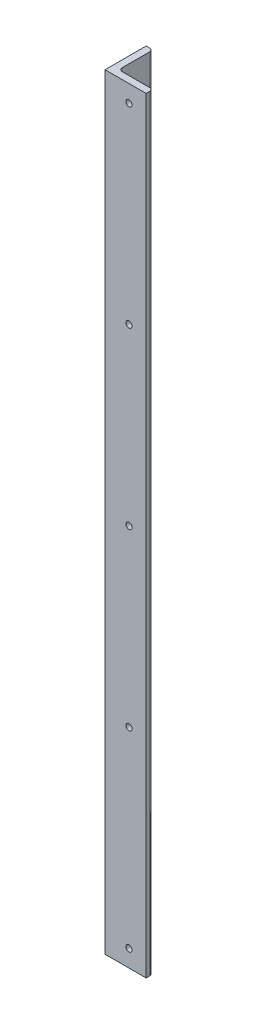
ISO-10303-21;
HEADER;
FILE_DESCRIPTION(('STEP AP214'),'2;1');
FILE_NAME('part.step','',(''),(''),'','','');
FILE_SCHEMA(('AUTOMOTIVE_DESIGN { 1 0 10303 214 1 1 1 1 }'));
ENDSEC;
DATA;
#1=APPLICATION_CONTEXT('core data for automotive mechanical design processes');
#2=APPLICATION_PROTOCOL_DEFINITION('international standard','automotive_design',2000,#1);
#3=PRODUCT_CONTEXT('',#1,'mechanical');
#4=PRODUCT('Part','Part','',(#3));
#5=PRODUCT_RELATED_PRODUCT_CATEGORY('part','',(#4));
#6=PRODUCT_DEFINITION_FORMATION('','',#4);
#7=PRODUCT_DEFINITION_CONTEXT('part definition',#1,'design');
#8=PRODUCT_DEFINITION('design','',#6,#7);
#9=PRODUCT_DEFINITION_SHAPE('','',#8);
#10=(LENGTH_UNIT() NAMED_UNIT(*) SI_UNIT(.MILLI.,.METRE.));
#11=(NAMED_UNIT(*) PLANE_ANGLE_UNIT() SI_UNIT($,.RADIAN.));
#12=(NAMED_UNIT(*) SI_UNIT($,.STERADIAN.) SOLID_ANGLE_UNIT());
#13=UNCERTAINTY_MEASURE_WITH_UNIT(LENGTH_MEASURE(1.E-05),#10,'distance_accuracy_value','');
#14=(GEOMETRIC_REPRESENTATION_CONTEXT(3) GLOBAL_UNCERTAINTY_ASSIGNED_CONTEXT((#13)) GLOBAL_UNIT_ASSIGNED_CONTEXT((#10,
#11,#12)) REPRESENTATION_CONTEXT('',''));
#15=CARTESIAN_POINT('',(0.,0.,0.));
#16=DIRECTION('',(0.,0.,1.));
#17=DIRECTION('',(1.,0.,0.));
#18=AXIS2_PLACEMENT_3D('',#15,#16,#17);
#19=CARTESIAN_POINT('',(0.,355.6,0.));
#20=DIRECTION('',(1.,0.,0.));
#21=DIRECTION('',(0.,0.,-1.));
#22=AXIS2_PLACEMENT_3D('',#19,#20,#21);
#23=PLANE('',#22);
#24=DIRECTION('',(0.,0.,1.));
#25=VECTOR('',#24,1.);
#26=CARTESIAN_POINT('',(0.,0.,0.));
#27=LINE('',#26,#25);
#28=CARTESIAN_POINT('',(0.,0.,-19.05));
#29=VERTEX_POINT('',#28);
#30=CARTESIAN_POINT('',(0.,0.,0.));
#31=VERTEX_POINT('',#30);
#32=EDGE_CURVE('E136',#29,#31,#27,.T.);
#33=ORIENTED_EDGE('',*,*,#32,.T.);
#34=DIRECTION('',(0.,-1.,0.));
#35=VECTOR('',#34,1.);
#36=CARTESIAN_POINT('',(0.,355.6,0.));
#37=LINE('',#36,#35);
#38=CARTESIAN_POINT('',(0.,355.6,0.));
#39=VERTEX_POINT('',#38);
#40=EDGE_CURVE('E11',#39,#31,#37,.T.);
#41=ORIENTED_EDGE('',*,*,#40,.F.);
#42=DIRECTION('',(0.,0.,1.));
#43=VECTOR('',#42,1.);
#44=CARTESIAN_POINT('',(0.,355.6,0.));
#45=LINE('',#44,#43);
#46=CARTESIAN_POINT('',(0.,355.6,-19.05));
#47=VERTEX_POINT('',#46);
#48=EDGE_CURVE('E153',#47,#39,#45,.T.);
#49=ORIENTED_EDGE('',*,*,#48,.F.);
#50=DIRECTION('',(0.,-1.,0.));
#51=VECTOR('',#50,1.);
#52=CARTESIAN_POINT('',(0.,355.6,-19.05));
#53=LINE('',#52,#51);
#54=EDGE_CURVE('E132',#47,#29,#53,.T.);
#55=ORIENTED_EDGE('',*,*,#54,.T.);
#56=EDGE_LOOP('',(#33,#41,#49,#55));
#57=FACE_BOUND('',#56,.T.);
#58=ADVANCED_FACE('F34',(#57),#23,.F.);
#59=CARTESIAN_POINT('',(0.,355.6,0.));
#60=DIRECTION('',(0.,0.,-1.));
#61=DIRECTION('',(-1.,0.,0.));
#62=AXIS2_PLACEMENT_3D('',#59,#60,#61);
#63=PLANE('',#62);
#64=CARTESIAN_POINT('',(11.1125,7.9375,0.));
#65=DIRECTION('',(0.,0.,-1.));
#66=DIRECTION('',(-1.,0.,0.));
#67=AXIS2_PLACEMENT_3D('',#64,#65,#66);
#68=CIRCLE('',#67,1.4224);
#69=CARTESIAN_POINT('',(9.6901,7.9375,0.));
#70=VERTEX_POINT('',#69);
#71=EDGE_CURVE('E140',#70,#70,#68,.T.);
#72=ORIENTED_EDGE('',*,*,#71,.T.);
#73=EDGE_LOOP('',(#72));
#74=FACE_BOUND('',#73,.T.);
#75=CARTESIAN_POINT('',(11.1125,258.7625,0.));
#76=DIRECTION('',(0.,0.,-1.));
#77=DIRECTION('',(-1.,0.,0.));
#78=AXIS2_PLACEMENT_3D('',#75,#76,#77);
#79=CIRCLE('',#78,1.42239999999999);
#80=CARTESIAN_POINT('',(9.69010000000001,258.7625,0.));
#81=VERTEX_POINT('',#80);
#82=EDGE_CURVE('E196',#81,#81,#79,.T.);
#83=ORIENTED_EDGE('',*,*,#82,.T.);
#84=EDGE_LOOP('',(#83));
#85=FACE_BOUND('',#84,.T.);
#86=CARTESIAN_POINT('',(11.1125,177.8,0.));
#87=DIRECTION('',(0.,0.,-1.));
#88=DIRECTION('',(-1.,0.,0.));
#89=AXIS2_PLACEMENT_3D('',#86,#87,#88);
#90=CIRCLE('',#89,1.4224);
#91=CARTESIAN_POINT('',(9.6901,177.8,0.));
#92=VERTEX_POINT('',#91);
#93=EDGE_CURVE('E199',#92,#92,#90,.T.);
#94=ORIENTED_EDGE('',*,*,#93,.T.);
#95=EDGE_LOOP('',(#94));
#96=FACE_BOUND('',#95,.T.);
#97=CARTESIAN_POINT('',(11.1125,96.8375,0.));
#98=DIRECTION('',(0.,0.,-1.));
#99=DIRECTION('',(-1.,0.,0.));
#100=AXIS2_PLACEMENT_3D('',#97,#98,#99);
#101=CIRCLE('',#100,1.4224);
#102=CARTESIAN_POINT('',(9.6901,96.8375,0.));
#103=VERTEX_POINT('',#102);
#104=EDGE_CURVE('E202',#103,#103,#101,.T.);
#105=ORIENTED_EDGE('',*,*,#104,.T.);
#106=EDGE_LOOP('',(#105));
#107=FACE_BOUND('',#106,.T.);
#108=CARTESIAN_POINT('',(11.1125,347.6625,0.));
#109=DIRECTION('',(0.,0.,-1.));
#110=DIRECTION('',(-1.,0.,0.));
#111=AXIS2_PLACEMENT_3D('',#108,#109,#110);
#112=CIRCLE('',#111,1.42239999999999);
#113=CARTESIAN_POINT('',(9.69010000000001,347.6625,0.));
#114=VERTEX_POINT('',#113);
#115=EDGE_CURVE('E205',#114,#114,#112,.T.);
#116=ORIENTED_EDGE('',*,*,#115,.T.);
#117=EDGE_LOOP('',(#116));
#118=FACE_BOUND('',#117,.T.);
#119=DIRECTION('',(1.,0.,0.));
#120=VECTOR('',#119,1.);
#121=CARTESIAN_POINT('',(0.,0.,0.));
#122=LINE('',#121,#120);
#123=CARTESIAN_POINT('',(19.05,0.,0.));
#124=VERTEX_POINT('',#123);
#125=EDGE_CURVE('E139',#31,#124,#122,.T.);
#126=ORIENTED_EDGE('',*,*,#125,.T.);
#127=DIRECTION('',(0.,-1.,0.));
#128=VECTOR('',#127,1.);
#129=CARTESIAN_POINT('',(19.05,355.6,0.));
#130=LINE('',#129,#128);
#131=CARTESIAN_POINT('',(19.05,355.6,0.));
#132=VERTEX_POINT('',#131);
#133=EDGE_CURVE('E42',#132,#124,#130,.T.);
#134=ORIENTED_EDGE('',*,*,#133,.F.);
#135=DIRECTION('',(1.,0.,0.));
#136=VECTOR('',#135,1.);
#137=CARTESIAN_POINT('',(0.,355.6,0.));
#138=LINE('',#137,#136);
#139=EDGE_CURVE('E96',#39,#132,#138,.T.);
#140=ORIENTED_EDGE('',*,*,#139,.F.);
#141=ORIENTED_EDGE('',*,*,#40,.T.);
#142=EDGE_LOOP('',(#126,#134,#140,#141));
#143=FACE_BOUND('',#142,.T.);
#144=ADVANCED_FACE('F246',(#74,#85,#96,#107,#118,#143),#63,.F.);
#145=CARTESIAN_POINT('',(19.05,355.6,-1.58749999999999));
#146=DIRECTION('',(-1.,0.,0.));
#147=DIRECTION('',(0.,0.,1.));
#148=AXIS2_PLACEMENT_3D('',#145,#146,#147);
#149=PLANE('',#148);
#150=DIRECTION('',(0.,0.,-1.));
#151=VECTOR('',#150,1.);
#152=CARTESIAN_POINT('',(19.05,0.,-1.58749999999999));
#153=LINE('',#152,#151);
#154=CARTESIAN_POINT('',(19.05,0.,-1.58749999999999));
#155=VERTEX_POINT('',#154);
#156=EDGE_CURVE('E142',#124,#155,#153,.T.);
#157=ORIENTED_EDGE('',*,*,#156,.T.);
#158=DIRECTION('',(0.,-1.,0.));
#159=VECTOR('',#158,1.);
#160=CARTESIAN_POINT('',(19.05,355.6,-1.58749999999999));
#161=LINE('',#160,#159);
#162=CARTESIAN_POINT('',(19.05,355.6,-1.58749999999999));
#163=VERTEX_POINT('',#162);
#164=EDGE_CURVE('E163',#163,#155,#161,.T.);
#165=ORIENTED_EDGE('',*,*,#164,.F.);
#166=DIRECTION('',(0.,0.,-1.));
#167=VECTOR('',#166,1.);
#168=CARTESIAN_POINT('',(19.05,355.6,-1.58749999999999));
#169=LINE('',#168,#167);
#170=EDGE_CURVE('E171',#132,#163,#169,.T.);
#171=ORIENTED_EDGE('',*,*,#170,.F.);
#172=ORIENTED_EDGE('',*,*,#133,.T.);
#173=EDGE_LOOP('',(#157,#165,#171,#172));
#174=FACE_BOUND('',#173,.T.);
#175=ADVANCED_FACE('F169',(#174),#149,.F.);
#176=CARTESIAN_POINT('',(17.4625,355.6,-1.5875));
#177=DIRECTION('',(0.,-1.,0.));
#178=DIRECTION('',(0.,0.,-1.));
#179=AXIS2_PLACEMENT_3D('',#176,#177,#178);
#180=CYLINDRICAL_SURFACE('',#179,1.5875);
#181=CARTESIAN_POINT('',(17.4625,0.,-1.5875));
#182=DIRECTION('',(0.,1.,0.));
#183=DIRECTION('',(0.,0.,-1.));
#184=AXIS2_PLACEMENT_3D('',#181,#182,#183);
#185=CIRCLE('',#184,1.5875);
#186=CARTESIAN_POINT('',(17.4625,0.,-3.175));
#187=VERTEX_POINT('',#186);
#188=EDGE_CURVE('E144',#155,#187,#185,.T.);
#189=ORIENTED_EDGE('',*,*,#188,.T.);
#190=DIRECTION('',(0.,-1.,0.));
#191=VECTOR('',#190,1.);
#192=CARTESIAN_POINT('',(17.4625,355.6,-3.175));
#193=LINE('',#192,#191);
#194=CARTESIAN_POINT('',(17.4625,355.6,-3.175));
#195=VERTEX_POINT('',#194);
#196=EDGE_CURVE('E160',#195,#187,#193,.T.);
#197=ORIENTED_EDGE('',*,*,#196,.F.);
#198=CARTESIAN_POINT('',(17.4625,355.6,-1.5875));
#199=DIRECTION('',(0.,1.,0.));
#200=DIRECTION('',(0.,0.,-1.));
#201=AXIS2_PLACEMENT_3D('',#198,#199,#200);
#202=CIRCLE('',#201,1.5875);
#203=EDGE_CURVE('E187',#163,#195,#202,.T.);
#204=ORIENTED_EDGE('',*,*,#203,.F.);
#205=ORIENTED_EDGE('',*,*,#164,.T.);
#206=EDGE_LOOP('',(#189,#197,#204,#205));
#207=FACE_BOUND('',#206,.T.);
#208=ADVANCED_FACE('F180',(#207),#180,.T.);
#209=CARTESIAN_POINT('',(4.76250000000001,355.6,-3.175));
#210=DIRECTION('',(0.,0.,1.));
#211=DIRECTION('',(1.,0.,0.));
#212=AXIS2_PLACEMENT_3D('',#209,#210,#211);
#213=PLANE('',#212);
#214=CARTESIAN_POINT('',(11.1125,7.9375,-3.175));
#215=DIRECTION('',(0.,0.,-1.));
#216=DIRECTION('',(-1.,0.,0.));
#217=AXIS2_PLACEMENT_3D('',#214,#215,#216);
#218=CIRCLE('',#217,1.4224);
#219=CARTESIAN_POINT('',(9.6901,7.9375,-3.175));
#220=VERTEX_POINT('',#219);
#221=EDGE_CURVE('E208',#220,#220,#218,.T.);
#222=ORIENTED_EDGE('',*,*,#221,.F.);
#223=EDGE_LOOP('',(#222));
#224=FACE_BOUND('',#223,.T.);
#225=CARTESIAN_POINT('',(11.1125,258.7625,-3.175));
#226=DIRECTION('',(0.,0.,-1.));
#227=DIRECTION('',(-1.,0.,0.));
#228=AXIS2_PLACEMENT_3D('',#225,#226,#227);
#229=CIRCLE('',#228,1.42239999999999);
#230=CARTESIAN_POINT('',(9.69010000000001,258.7625,-3.175));
#231=VERTEX_POINT('',#230);
#232=EDGE_CURVE('E216',#231,#231,#229,.T.);
#233=ORIENTED_EDGE('',*,*,#232,.F.);
#234=EDGE_LOOP('',(#233));
#235=FACE_BOUND('',#234,.T.);
#236=CARTESIAN_POINT('',(11.1125,177.8,-3.175));
#237=DIRECTION('',(0.,0.,-1.));
#238=DIRECTION('',(-1.,0.,0.));
#239=AXIS2_PLACEMENT_3D('',#236,#237,#238);
#240=CIRCLE('',#239,1.4224);
#241=CARTESIAN_POINT('',(9.6901,177.8,-3.175));
#242=VERTEX_POINT('',#241);
#243=EDGE_CURVE('E213',#242,#242,#240,.T.);
#244=ORIENTED_EDGE('',*,*,#243,.F.);
#245=EDGE_LOOP('',(#244));
#246=FACE_BOUND('',#245,.T.);
#247=CARTESIAN_POINT('',(11.1125,96.8375,-3.175));
#248=DIRECTION('',(0.,0.,-1.));
#249=DIRECTION('',(-1.,0.,0.));
#250=AXIS2_PLACEMENT_3D('',#247,#248,#249);
#251=CIRCLE('',#250,1.4224);
#252=CARTESIAN_POINT('',(9.6901,96.8375,-3.175));
#253=VERTEX_POINT('',#252);
#254=EDGE_CURVE('E209',#253,#253,#251,.T.);
#255=ORIENTED_EDGE('',*,*,#254,.F.);
#256=EDGE_LOOP('',(#255));
#257=FACE_BOUND('',#256,.T.);
#258=CARTESIAN_POINT('',(11.1125,347.6625,-3.175));
#259=DIRECTION('',(0.,0.,-1.));
#260=DIRECTION('',(-1.,0.,0.));
#261=AXIS2_PLACEMENT_3D('',#258,#259,#260);
#262=CIRCLE('',#261,1.42239999999999);
#263=CARTESIAN_POINT('',(9.69010000000001,347.6625,-3.175));
#264=VERTEX_POINT('',#263);
#265=EDGE_CURVE('E212',#264,#264,#262,.T.);
#266=ORIENTED_EDGE('',*,*,#265,.F.);
#267=EDGE_LOOP('',(#266));
#268=FACE_BOUND('',#267,.T.);
#269=DIRECTION('',(-1.,0.,0.));
#270=VECTOR('',#269,1.);
#271=CARTESIAN_POINT('',(4.76250000000001,0.,-3.175));
#272=LINE('',#271,#270);
#273=CARTESIAN_POINT('',(4.76250000000001,0.,-3.175));
#274=VERTEX_POINT('',#273);
#275=EDGE_CURVE('E146',#187,#274,#272,.T.);
#276=ORIENTED_EDGE('',*,*,#275,.T.);
#277=DIRECTION('',(0.,-1.,0.));
#278=VECTOR('',#277,1.);
#279=CARTESIAN_POINT('',(4.76250000000001,355.6,-3.175));
#280=LINE('',#279,#278);
#281=CARTESIAN_POINT('',(4.76250000000001,355.6,-3.175));
#282=VERTEX_POINT('',#281);
#283=EDGE_CURVE('E157',#282,#274,#280,.T.);
#284=ORIENTED_EDGE('',*,*,#283,.F.);
#285=DIRECTION('',(-1.,0.,0.));
#286=VECTOR('',#285,1.);
#287=CARTESIAN_POINT('',(4.76250000000001,355.6,-3.175));
#288=LINE('',#287,#286);
#289=EDGE_CURVE('E186',#195,#282,#288,.T.);
#290=ORIENTED_EDGE('',*,*,#289,.F.);
#291=ORIENTED_EDGE('',*,*,#196,.T.);
#292=EDGE_LOOP('',(#276,#284,#290,#291));
#293=FACE_BOUND('',#292,.T.);
#294=ADVANCED_FACE('F184',(#224,#235,#246,#257,#268,#293),#213,.F.);
#295=CARTESIAN_POINT('',(4.7625,355.6,-4.7625));
#296=DIRECTION('',(0.,-1.,0.));
#297=DIRECTION('',(0.,0.,-1.));
#298=AXIS2_PLACEMENT_3D('',#295,#296,#297);
#299=CYLINDRICAL_SURFACE('',#298,1.5875);
#300=CARTESIAN_POINT('',(4.7625,0.,-4.7625));
#301=DIRECTION('',(0.,-1.,0.));
#302=DIRECTION('',(0.,0.,1.));
#303=AXIS2_PLACEMENT_3D('',#300,#301,#302);
#304=CIRCLE('',#303,1.5875);
#305=CARTESIAN_POINT('',(3.175,0.,-4.76250000000001));
#306=VERTEX_POINT('',#305);
#307=EDGE_CURVE('E148',#274,#306,#304,.T.);
#308=ORIENTED_EDGE('',*,*,#307,.T.);
#309=DIRECTION('',(0.,-1.,0.));
#310=VECTOR('',#309,1.);
#311=CARTESIAN_POINT('',(3.175,355.6,-4.76250000000001));
#312=LINE('',#311,#310);
#313=CARTESIAN_POINT('',(3.175,355.6,-4.76250000000001));
#314=VERTEX_POINT('',#313);
#315=EDGE_CURVE('E127',#314,#306,#312,.T.);
#316=ORIENTED_EDGE('',*,*,#315,.F.);
#317=CARTESIAN_POINT('',(4.7625,355.6,-4.7625));
#318=DIRECTION('',(0.,-1.,0.));
#319=DIRECTION('',(0.,0.,1.));
#320=AXIS2_PLACEMENT_3D('',#317,#318,#319);
#321=CIRCLE('',#320,1.5875);
#322=EDGE_CURVE('E118',#282,#314,#321,.T.);
#323=ORIENTED_EDGE('',*,*,#322,.F.);
#324=ORIENTED_EDGE('',*,*,#283,.T.);
#325=EDGE_LOOP('',(#308,#316,#323,#324));
#326=FACE_BOUND('',#325,.T.);
#327=ADVANCED_FACE('F229',(#326),#299,.F.);
#328=CARTESIAN_POINT('',(3.175,355.6,-4.76250000000001));
#329=DIRECTION('',(-1.,0.,0.));
#330=DIRECTION('',(0.,0.,1.));
#331=AXIS2_PLACEMENT_3D('',#328,#329,#330);
#332=PLANE('',#331);
#333=DIRECTION('',(0.,0.,-1.));
#334=VECTOR('',#333,1.);
#335=CARTESIAN_POINT('',(3.175,0.,-4.76250000000001));
#336=LINE('',#335,#334);
#337=CARTESIAN_POINT('',(3.175,0.,-17.4625));
#338=VERTEX_POINT('',#337);
#339=EDGE_CURVE('E126',#306,#338,#336,.T.);
#340=ORIENTED_EDGE('',*,*,#339,.T.);
#341=DIRECTION('',(0.,-1.,0.));
#342=VECTOR('',#341,1.);
#343=CARTESIAN_POINT('',(3.175,355.6,-17.4625));
#344=LINE('',#343,#342);
#345=CARTESIAN_POINT('',(3.175,355.6,-17.4625));
#346=VERTEX_POINT('',#345);
#347=EDGE_CURVE('E123',#346,#338,#344,.T.);
#348=ORIENTED_EDGE('',*,*,#347,.F.);
#349=DIRECTION('',(0.,0.,-1.));
#350=VECTOR('',#349,1.);
#351=CARTESIAN_POINT('',(3.175,355.6,-4.76250000000001));
#352=LINE('',#351,#350);
#353=EDGE_CURVE('E112',#314,#346,#352,.T.);
#354=ORIENTED_EDGE('',*,*,#353,.F.);
#355=ORIENTED_EDGE('',*,*,#315,.T.);
#356=EDGE_LOOP('',(#340,#348,#354,#355));
#357=FACE_BOUND('',#356,.T.);
#358=ADVANCED_FACE('F124',(#357),#332,.F.);
#359=CARTESIAN_POINT('',(1.5875,355.6,-17.4625));
#360=DIRECTION('',(0.,-1.,0.));
#361=DIRECTION('',(0.,0.,-1.));
#362=AXIS2_PLACEMENT_3D('',#359,#360,#361);
#363=CYLINDRICAL_SURFACE('',#362,1.5875);
#364=CARTESIAN_POINT('',(1.5875,0.,-17.4625));
#365=DIRECTION('',(0.,1.,0.));
#366=DIRECTION('',(0.,0.,1.));
#367=AXIS2_PLACEMENT_3D('',#364,#365,#366);
#368=CIRCLE('',#367,1.5875);
#369=CARTESIAN_POINT('',(1.58749999999999,0.,-19.05));
#370=VERTEX_POINT('',#369);
#371=EDGE_CURVE('E82',#338,#370,#368,.T.);
#372=ORIENTED_EDGE('',*,*,#371,.T.);
#373=DIRECTION('',(0.,-1.,0.));
#374=VECTOR('',#373,1.);
#375=CARTESIAN_POINT('',(1.58749999999999,355.6,-19.05));
#376=LINE('',#375,#374);
#377=CARTESIAN_POINT('',(1.58749999999999,355.6,-19.05));
#378=VERTEX_POINT('',#377);
#379=EDGE_CURVE('E128',#378,#370,#376,.T.);
#380=ORIENTED_EDGE('',*,*,#379,.F.);
#381=CARTESIAN_POINT('',(1.5875,355.6,-17.4625));
#382=DIRECTION('',(0.,1.,0.));
#383=DIRECTION('',(0.,0.,1.));
#384=AXIS2_PLACEMENT_3D('',#381,#382,#383);
#385=CIRCLE('',#384,1.5875);
#386=EDGE_CURVE('E116',#346,#378,#385,.T.);
#387=ORIENTED_EDGE('',*,*,#386,.F.);
#388=ORIENTED_EDGE('',*,*,#347,.T.);
#389=EDGE_LOOP('',(#372,#380,#387,#388));
#390=FACE_BOUND('',#389,.T.);
#391=ADVANCED_FACE('F130',(#390),#363,.T.);
#392=CARTESIAN_POINT('',(0.,355.6,-19.05));
#393=DIRECTION('',(0.,0.,1.));
#394=DIRECTION('',(1.,0.,0.));
#395=AXIS2_PLACEMENT_3D('',#392,#393,#394);
#396=PLANE('',#395);
#397=DIRECTION('',(-1.,0.,0.));
#398=VECTOR('',#397,1.);
#399=CARTESIAN_POINT('',(0.,0.,-19.05));
#400=LINE('',#399,#398);
#401=EDGE_CURVE('E88',#370,#29,#400,.T.);
#402=ORIENTED_EDGE('',*,*,#401,.T.);
#403=ORIENTED_EDGE('',*,*,#54,.F.);
#404=DIRECTION('',(-1.,0.,0.));
#405=VECTOR('',#404,1.);
#406=CARTESIAN_POINT('',(0.,355.6,-19.05));
#407=LINE('',#406,#405);
#408=EDGE_CURVE('E50',#378,#47,#407,.T.);
#409=ORIENTED_EDGE('',*,*,#408,.F.);
#410=ORIENTED_EDGE('',*,*,#379,.T.);
#411=EDGE_LOOP('',(#402,#403,#409,#410));
#412=FACE_BOUND('',#411,.T.);
#413=ADVANCED_FACE('F338',(#412),#396,.F.);
#414=CARTESIAN_POINT('',(1.5875,355.6,-17.4625));
#415=DIRECTION('',(0.,1.,0.));
#416=DIRECTION('',(0.,0.,1.));
#417=AXIS2_PLACEMENT_3D('',#414,#415,#416);
#418=PLANE('',#417);
#419=ORIENTED_EDGE('',*,*,#48,.T.);
#420=ORIENTED_EDGE('',*,*,#139,.T.);
#421=ORIENTED_EDGE('',*,*,#170,.T.);
#422=ORIENTED_EDGE('',*,*,#203,.T.);
#423=ORIENTED_EDGE('',*,*,#289,.T.);
#424=ORIENTED_EDGE('',*,*,#322,.T.);
#425=ORIENTED_EDGE('',*,*,#353,.T.);
#426=ORIENTED_EDGE('',*,*,#386,.T.);
#427=ORIENTED_EDGE('',*,*,#408,.T.);
#428=EDGE_LOOP('',(#419,#420,#421,#422,#423,#424,#425,#426,#427));
#429=FACE_BOUND('',#428,.T.);
#430=ADVANCED_FACE('F114',(#429),#418,.T.);
#431=CARTESIAN_POINT('',(1.5875,0.,-17.4625));
#432=DIRECTION('',(0.,1.,0.));
#433=DIRECTION('',(0.,0.,1.));
#434=AXIS2_PLACEMENT_3D('',#431,#432,#433);
#435=PLANE('',#434);
#436=ORIENTED_EDGE('',*,*,#32,.F.);
#437=ORIENTED_EDGE('',*,*,#401,.F.);
#438=ORIENTED_EDGE('',*,*,#371,.F.);
#439=ORIENTED_EDGE('',*,*,#339,.F.);
#440=ORIENTED_EDGE('',*,*,#307,.F.);
#441=ORIENTED_EDGE('',*,*,#275,.F.);
#442=ORIENTED_EDGE('',*,*,#188,.F.);
#443=ORIENTED_EDGE('',*,*,#156,.F.);
#444=ORIENTED_EDGE('',*,*,#125,.F.);
#445=EDGE_LOOP('',(#436,#437,#438,#439,#440,#441,#442,#443,#444));
#446=FACE_BOUND('',#445,.T.);
#447=ADVANCED_FACE('F175',(#446),#435,.F.);
#448=CARTESIAN_POINT('',(11.1125,347.6625,1.905));
#449=DIRECTION('',(0.,0.,-1.));
#450=DIRECTION('',(-1.,0.,0.));
#451=AXIS2_PLACEMENT_3D('',#448,#449,#450);
#452=CYLINDRICAL_SURFACE('',#451,1.42239999999999);
#453=ORIENTED_EDGE('',*,*,#265,.T.);
#454=EDGE_LOOP('',(#453));
#455=FACE_BOUND('',#454,.T.);
#456=ORIENTED_EDGE('',*,*,#115,.F.);
#457=EDGE_LOOP('',(#456));
#458=FACE_BOUND('',#457,.T.);
#459=ADVANCED_FACE('F239',(#455,#458),#452,.F.);
#460=CARTESIAN_POINT('',(11.1125,96.8375,1.905));
#461=DIRECTION('',(0.,0.,-1.));
#462=DIRECTION('',(-1.,0.,0.));
#463=AXIS2_PLACEMENT_3D('',#460,#461,#462);
#464=CYLINDRICAL_SURFACE('',#463,1.4224);
#465=ORIENTED_EDGE('',*,*,#254,.T.);
#466=EDGE_LOOP('',(#465));
#467=FACE_BOUND('',#466,.T.);
#468=ORIENTED_EDGE('',*,*,#104,.F.);
#469=EDGE_LOOP('',(#468));
#470=FACE_BOUND('',#469,.T.);
#471=ADVANCED_FACE('F242',(#467,#470),#464,.F.);
#472=CARTESIAN_POINT('',(11.1125,177.8,1.905));
#473=DIRECTION('',(0.,0.,-1.));
#474=DIRECTION('',(-1.,0.,0.));
#475=AXIS2_PLACEMENT_3D('',#472,#473,#474);
#476=CYLINDRICAL_SURFACE('',#475,1.4224);
#477=ORIENTED_EDGE('',*,*,#243,.T.);
#478=EDGE_LOOP('',(#477));
#479=FACE_BOUND('',#478,.T.);
#480=ORIENTED_EDGE('',*,*,#93,.F.);
#481=EDGE_LOOP('',(#480));
#482=FACE_BOUND('',#481,.T.);
#483=ADVANCED_FACE('F303',(#479,#482),#476,.F.);
#484=CARTESIAN_POINT('',(11.1125,258.7625,1.905));
#485=DIRECTION('',(0.,0.,-1.));
#486=DIRECTION('',(-1.,0.,0.));
#487=AXIS2_PLACEMENT_3D('',#484,#485,#486);
#488=CYLINDRICAL_SURFACE('',#487,1.42239999999999);
#489=ORIENTED_EDGE('',*,*,#232,.T.);
#490=EDGE_LOOP('',(#489));
#491=FACE_BOUND('',#490,.T.);
#492=ORIENTED_EDGE('',*,*,#82,.F.);
#493=EDGE_LOOP('',(#492));
#494=FACE_BOUND('',#493,.T.);
#495=ADVANCED_FACE('F313',(#491,#494),#488,.F.);
#496=CARTESIAN_POINT('',(11.1125,7.9375,1.905));
#497=DIRECTION('',(0.,0.,-1.));
#498=DIRECTION('',(-1.,0.,0.));
#499=AXIS2_PLACEMENT_3D('',#496,#497,#498);
#500=CYLINDRICAL_SURFACE('',#499,1.4224);
#501=ORIENTED_EDGE('',*,*,#221,.T.);
#502=EDGE_LOOP('',(#501));
#503=FACE_BOUND('',#502,.T.);
#504=ORIENTED_EDGE('',*,*,#71,.F.);
#505=EDGE_LOOP('',(#504));
#506=FACE_BOUND('',#505,.T.);
#507=ADVANCED_FACE('F224',(#503,#506),#500,.F.);
#508=CLOSED_SHELL('',(#58,#144,#175,#208,#294,#327,#358,#391,#413,#430,#447,#459,#471,#483,#495,#507));
#509=MANIFOLD_SOLID_BREP('B2',#508);
#510=ADVANCED_BREP_SHAPE_REPRESENTATION('',(#18,#509),#14);
#511=SHAPE_DEFINITION_REPRESENTATION(#9,#510);
ENDSEC;
END-ISO-10303-21;
